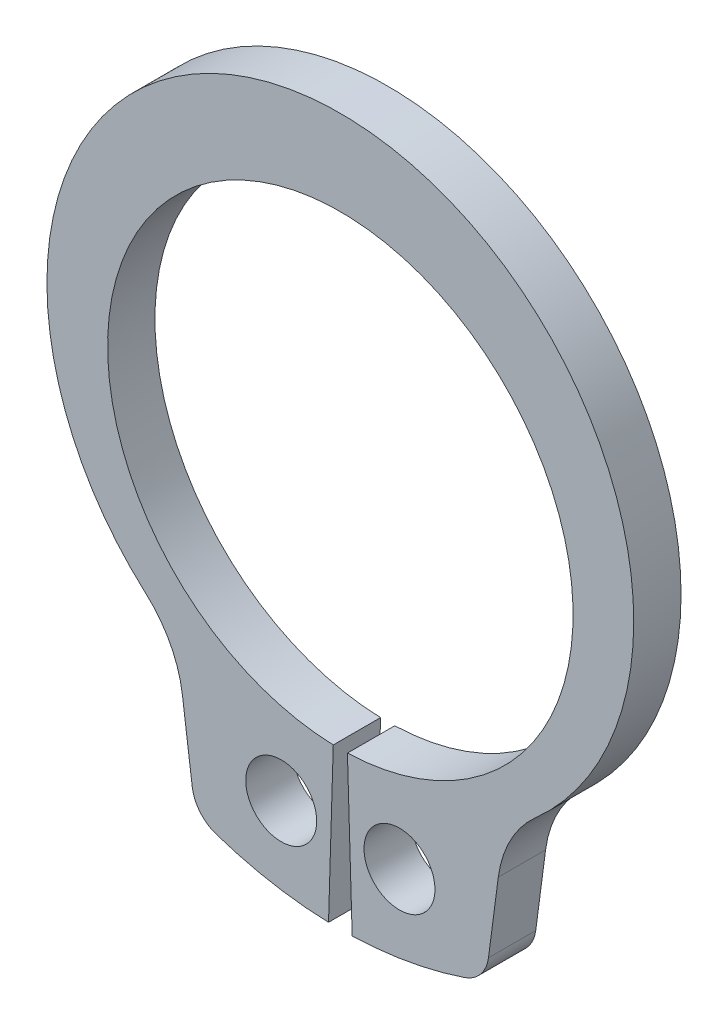
ISO-10303-21;
HEADER;
FILE_DESCRIPTION(('STEP AP214'),'2;1');
FILE_NAME('part.step','',(''),(''),'','','');
FILE_SCHEMA(('AUTOMOTIVE_DESIGN { 1 0 10303 214 1 1 1 1 }'));
ENDSEC;
DATA;
#1=APPLICATION_CONTEXT('core data for automotive mechanical design processes');
#2=APPLICATION_PROTOCOL_DEFINITION('international standard','automotive_design',2000,#1);
#3=PRODUCT_CONTEXT('',#1,'mechanical');
#4=PRODUCT('Part','Part','',(#3));
#5=PRODUCT_RELATED_PRODUCT_CATEGORY('part','',(#4));
#6=PRODUCT_DEFINITION_FORMATION('','',#4);
#7=PRODUCT_DEFINITION_CONTEXT('part definition',#1,'design');
#8=PRODUCT_DEFINITION('design','',#6,#7);
#9=PRODUCT_DEFINITION_SHAPE('','',#8);
#10=(LENGTH_UNIT() NAMED_UNIT(*) SI_UNIT(.MILLI.,.METRE.));
#11=(NAMED_UNIT(*) PLANE_ANGLE_UNIT() SI_UNIT($,.RADIAN.));
#12=(NAMED_UNIT(*) SI_UNIT($,.STERADIAN.) SOLID_ANGLE_UNIT());
#13=UNCERTAINTY_MEASURE_WITH_UNIT(LENGTH_MEASURE(1.E-05),#10,'distance_accuracy_value','');
#14=(GEOMETRIC_REPRESENTATION_CONTEXT(3) GLOBAL_UNCERTAINTY_ASSIGNED_CONTEXT((#13)) GLOBAL_UNIT_ASSIGNED_CONTEXT((#10,
#11,#12)) REPRESENTATION_CONTEXT('',''));
#15=CARTESIAN_POINT('',(0.,0.,0.));
#16=DIRECTION('',(0.,0.,1.));
#17=DIRECTION('',(1.,0.,0.));
#18=AXIS2_PLACEMENT_3D('',#15,#16,#17);
#19=CARTESIAN_POINT('',(0.,0.,-1.));
#20=DIRECTION('',(0.,0.,1.));
#21=DIRECTION('',(1.,0.,0.));
#22=AXIS2_PLACEMENT_3D('',#19,#20,#21);
#23=CYLINDRICAL_SURFACE('',#22,4.92);
#24=CARTESIAN_POINT('',(0.,0.,0.));
#25=DIRECTION('',(0.,0.,-1.));
#26=DIRECTION('',(1.,0.,0.));
#27=AXIS2_PLACEMENT_3D('',#24,#25,#26);
#28=CIRCLE('',#27,4.92);
#29=CARTESIAN_POINT('',(-0.14963503649635,-4.9177240015939,0.));
#30=VERTEX_POINT('',#29);
#31=CARTESIAN_POINT('',(0.14963503649635,-4.9177240015939,0.));
#32=VERTEX_POINT('',#31);
#33=EDGE_CURVE('E122',#30,#32,#28,.T.);
#34=ORIENTED_EDGE('',*,*,#33,.F.);
#35=DIRECTION('',(0.,0.,1.));
#36=VECTOR('',#35,1.);
#37=CARTESIAN_POINT('',(-0.14963503649635,-4.9177240015939,-1.));
#38=LINE('',#37,#36);
#39=CARTESIAN_POINT('',(-0.14963503649635,-4.9177240015939,-1.));
#40=VERTEX_POINT('',#39);
#41=EDGE_CURVE('E11',#40,#30,#38,.T.);
#42=ORIENTED_EDGE('',*,*,#41,.F.);
#43=CARTESIAN_POINT('',(0.,0.,-1.));
#44=DIRECTION('',(0.,0.,-1.));
#45=DIRECTION('',(1.,0.,0.));
#46=AXIS2_PLACEMENT_3D('',#43,#44,#45);
#47=CIRCLE('',#46,4.92);
#48=CARTESIAN_POINT('',(0.14963503649635,-4.9177240015939,-1.));
#49=VERTEX_POINT('',#48);
#50=EDGE_CURVE('E124',#40,#49,#47,.T.);
#51=ORIENTED_EDGE('',*,*,#50,.T.);
#52=DIRECTION('',(0.,0.,1.));
#53=VECTOR('',#52,1.);
#54=CARTESIAN_POINT('',(0.14963503649635,-4.9177240015939,-1.));
#55=LINE('',#54,#53);
#56=EDGE_CURVE('E37',#49,#32,#55,.T.);
#57=ORIENTED_EDGE('',*,*,#56,.T.);
#58=EDGE_LOOP('',(#34,#42,#51,#57));
#59=FACE_BOUND('',#58,.T.);
#60=ADVANCED_FACE('F34',(#59),#23,.F.);
#61=CARTESIAN_POINT('',(-0.14963503649635,-4.9177240015939,-1.));
#62=DIRECTION('',(0.999537398697947,-0.0304136253041363,0.));
#63=DIRECTION('',(0.0304136253041363,0.999537398697948,0.));
#64=AXIS2_PLACEMENT_3D('',#61,#62,#63);
#65=PLANE('',#64);
#66=DIRECTION('',(0.0304136253041363,0.999537398697948,0.));
#67=VECTOR('',#66,1.);
#68=CARTESIAN_POINT('',(-0.14963503649635,-4.9177240015939,0.));
#69=LINE('',#68,#67);
#70=CARTESIAN_POINT('',(-0.25,-8.21619741729713,0.));
#71=VERTEX_POINT('',#70);
#72=EDGE_CURVE('E140',#71,#30,#69,.T.);
#73=ORIENTED_EDGE('',*,*,#72,.F.);
#74=DIRECTION('',(0.,0.,1.));
#75=VECTOR('',#74,1.);
#76=CARTESIAN_POINT('',(-0.25,-8.21619741729713,-1.));
#77=LINE('',#76,#75);
#78=CARTESIAN_POINT('',(-0.25,-8.21619741729713,-1.));
#79=VERTEX_POINT('',#78);
#80=EDGE_CURVE('E42',#79,#71,#77,.T.);
#81=ORIENTED_EDGE('',*,*,#80,.F.);
#82=DIRECTION('',(0.0304136253041363,0.999537398697948,0.));
#83=VECTOR('',#82,1.);
#84=CARTESIAN_POINT('',(-0.14963503649635,-4.9177240015939,-1.));
#85=LINE('',#84,#83);
#86=EDGE_CURVE('E129',#79,#40,#85,.T.);
#87=ORIENTED_EDGE('',*,*,#86,.T.);
#88=ORIENTED_EDGE('',*,*,#41,.T.);
#89=EDGE_LOOP('',(#73,#81,#87,#88));
#90=FACE_BOUND('',#89,.T.);
#91=ADVANCED_FACE('F252',(#90),#65,.T.);
#92=CARTESIAN_POINT('',(0.,0.,-1.));
#93=DIRECTION('',(0.,0.,1.));
#94=DIRECTION('',(1.,0.,0.));
#95=AXIS2_PLACEMENT_3D('',#92,#93,#94);
#96=CYLINDRICAL_SURFACE('',#95,8.22);
#97=CARTESIAN_POINT('',(0.,0.,0.));
#98=DIRECTION('',(0.,0.,1.));
#99=DIRECTION('',(1.,0.,0.));
#100=AXIS2_PLACEMENT_3D('',#97,#98,#99);
#101=CIRCLE('',#100,8.22);
#102=CARTESIAN_POINT('',(-2.62681349790227,-7.78898265803939,0.));
#103=VERTEX_POINT('',#102);
#104=EDGE_CURVE('E170',#103,#71,#101,.T.);
#105=ORIENTED_EDGE('',*,*,#104,.F.);
#106=DIRECTION('',(0.,0.,1.));
#107=VECTOR('',#106,1.);
#108=CARTESIAN_POINT('',(-2.62681349790227,-7.78898265803939,-1.));
#109=LINE('',#108,#107);
#110=CARTESIAN_POINT('',(-2.62681349790227,-7.78898265803939,-1.));
#111=VERTEX_POINT('',#110);
#112=EDGE_CURVE('E204',#111,#103,#109,.T.);
#113=ORIENTED_EDGE('',*,*,#112,.F.);
#114=CARTESIAN_POINT('',(0.,0.,-1.));
#115=DIRECTION('',(0.,0.,1.));
#116=DIRECTION('',(1.,0.,0.));
#117=AXIS2_PLACEMENT_3D('',#114,#115,#116);
#118=CIRCLE('',#117,8.22);
#119=EDGE_CURVE('E200',#111,#79,#118,.T.);
#120=ORIENTED_EDGE('',*,*,#119,.T.);
#121=ORIENTED_EDGE('',*,*,#80,.T.);
#122=EDGE_LOOP('',(#105,#113,#120,#121));
#123=FACE_BOUND('',#122,.T.);
#124=ADVANCED_FACE('F257',(#123),#96,.T.);
#125=CARTESIAN_POINT('',(-2.38714073349513,-7.07830905785332,-1.));
#126=DIRECTION('',(0.,0.,1.));
#127=DIRECTION('',(1.,0.,0.));
#128=AXIS2_PLACEMENT_3D('',#125,#126,#127);
#129=CYLINDRICAL_SURFACE('',#128,0.750000000000002);
#130=CARTESIAN_POINT('',(-2.38714073349513,-7.07830905785332,0.));
#131=DIRECTION('',(0.,0.,1.));
#132=DIRECTION('',(1.,0.,0.));
#133=AXIS2_PLACEMENT_3D('',#130,#131,#132);
#134=CIRCLE('',#133,0.750000000000002);
#135=CARTESIAN_POINT('',(-3.13072437952549,-7.17620370201836,0.));
#136=VERTEX_POINT('',#135);
#137=EDGE_CURVE('E167',#136,#103,#134,.T.);
#138=ORIENTED_EDGE('',*,*,#137,.F.);
#139=DIRECTION('',(0.,0.,1.));
#140=VECTOR('',#139,1.);
#141=CARTESIAN_POINT('',(-3.13072437952549,-7.17620370201836,-1.));
#142=LINE('',#141,#140);
#143=CARTESIAN_POINT('',(-3.13072437952549,-7.17620370201836,-1.));
#144=VERTEX_POINT('',#143);
#145=EDGE_CURVE('E206',#144,#136,#142,.T.);
#146=ORIENTED_EDGE('',*,*,#145,.F.);
#147=CARTESIAN_POINT('',(-2.38714073349513,-7.07830905785332,-1.));
#148=DIRECTION('',(0.,0.,1.));
#149=DIRECTION('',(1.,0.,0.));
#150=AXIS2_PLACEMENT_3D('',#147,#148,#149);
#151=CIRCLE('',#150,0.750000000000002);
#152=EDGE_CURVE('E197',#144,#111,#151,.T.);
#153=ORIENTED_EDGE('',*,*,#152,.T.);
#154=ORIENTED_EDGE('',*,*,#112,.T.);
#155=EDGE_LOOP('',(#138,#146,#153,#154));
#156=FACE_BOUND('',#155,.T.);
#157=ADVANCED_FACE('F249',(#156),#129,.T.);
#158=CARTESIAN_POINT('',(-3.33891012449069,-5.59487597348818,-1.));
#159=DIRECTION('',(-0.991444861373811,-0.130526192220051,0.));
#160=DIRECTION('',(0.130526192220051,-0.991444861373811,0.));
#161=AXIS2_PLACEMENT_3D('',#158,#159,#160);
#162=PLANE('',#161);
#163=DIRECTION('',(0.130526192220051,-0.99144486137381,0.));
#164=VECTOR('',#163,1.);
#165=CARTESIAN_POINT('',(-3.33891012449069,-5.59487597348818,0.));
#166=LINE('',#165,#164);
#167=CARTESIAN_POINT('',(-3.33891012449069,-5.59487597348818,0.));
#168=VERTEX_POINT('',#167);
#169=EDGE_CURVE('E164',#168,#136,#166,.T.);
#170=ORIENTED_EDGE('',*,*,#169,.F.);
#171=DIRECTION('',(0.,0.,1.));
#172=VECTOR('',#171,1.);
#173=CARTESIAN_POINT('',(-3.33891012449069,-5.59487597348818,-1.));
#174=LINE('',#173,#172);
#175=CARTESIAN_POINT('',(-3.33891012449069,-5.59487597348818,-1.));
#176=VERTEX_POINT('',#175);
#177=EDGE_CURVE('E208',#176,#168,#174,.T.);
#178=ORIENTED_EDGE('',*,*,#177,.F.);
#179=DIRECTION('',(0.130526192220051,-0.99144486137381,0.));
#180=VECTOR('',#179,1.);
#181=CARTESIAN_POINT('',(-3.33891012449069,-5.59487597348818,-1.));
#182=LINE('',#181,#180);
#183=EDGE_CURVE('E194',#176,#144,#182,.T.);
#184=ORIENTED_EDGE('',*,*,#183,.T.);
#185=ORIENTED_EDGE('',*,*,#145,.T.);
#186=EDGE_LOOP('',(#170,#178,#184,#185));
#187=FACE_BOUND('',#186,.T.);
#188=ADVANCED_FACE('F245',(#187),#162,.T.);
#189=CARTESIAN_POINT('',(-5.71548705813683,-5.90775826251129,-1.));
#190=DIRECTION('',(0.,0.,1.));
#191=DIRECTION('',(1.,0.,0.));
#192=AXIS2_PLACEMENT_3D('',#189,#190,#191);
#193=CYLINDRICAL_SURFACE('',#192,2.39708432232227);
#194=CARTESIAN_POINT('',(-5.71548705813683,-5.90775826251129,0.));
#195=DIRECTION('',(0.,0.,-1.));
#196=DIRECTION('',(1.,0.,0.));
#197=AXIS2_PLACEMENT_3D('',#194,#195,#196);
#198=CIRCLE('',#197,2.39708432232227);
#199=CARTESIAN_POINT('',(-4.12231510789726,-4.11672046690421,0.));
#200=VERTEX_POINT('',#199);
#201=EDGE_CURVE('E161',#200,#168,#198,.T.);
#202=ORIENTED_EDGE('',*,*,#201,.F.);
#203=DIRECTION('',(0.,0.,1.));
#204=VECTOR('',#203,1.);
#205=CARTESIAN_POINT('',(-4.12231510789726,-4.11672046690421,-1.));
#206=LINE('',#205,#204);
#207=CARTESIAN_POINT('',(-4.12231510789726,-4.11672046690421,-1.));
#208=VERTEX_POINT('',#207);
#209=EDGE_CURVE('E210',#208,#200,#206,.T.);
#210=ORIENTED_EDGE('',*,*,#209,.F.);
#211=CARTESIAN_POINT('',(-5.71548705813683,-5.90775826251129,-1.));
#212=DIRECTION('',(0.,0.,-1.));
#213=DIRECTION('',(1.,0.,0.));
#214=AXIS2_PLACEMENT_3D('',#211,#212,#213);
#215=CIRCLE('',#214,2.39708432232227);
#216=EDGE_CURVE('E191',#208,#176,#215,.T.);
#217=ORIENTED_EDGE('',*,*,#216,.T.);
#218=ORIENTED_EDGE('',*,*,#177,.T.);
#219=EDGE_LOOP('',(#202,#210,#217,#218));
#220=FACE_BOUND('',#219,.T.);
#221=ADVANCED_FACE('F241',(#220),#193,.F.);
#222=CARTESIAN_POINT('',(0.,0.517570365630119,-1.));
#223=DIRECTION('',(0.,0.,1.));
#224=DIRECTION('',(1.,0.,0.));
#225=AXIS2_PLACEMENT_3D('',#222,#223,#224);
#226=CYLINDRICAL_SURFACE('',#225,6.20242963436988);
#227=CARTESIAN_POINT('',(0.,0.517570365630119,0.));
#228=DIRECTION('',(0.,0.,1.));
#229=DIRECTION('',(1.,0.,0.));
#230=AXIS2_PLACEMENT_3D('',#227,#228,#229);
#231=CIRCLE('',#230,6.20242963436988);
#232=CARTESIAN_POINT('',(4.12231510789726,-4.11672046690421,0.));
#233=VERTEX_POINT('',#232);
#234=EDGE_CURVE('E158',#233,#200,#231,.T.);
#235=ORIENTED_EDGE('',*,*,#234,.F.);
#236=DIRECTION('',(0.,0.,1.));
#237=VECTOR('',#236,1.);
#238=CARTESIAN_POINT('',(4.12231510789726,-4.11672046690421,-1.));
#239=LINE('',#238,#237);
#240=CARTESIAN_POINT('',(4.12231510789726,-4.11672046690421,-1.));
#241=VERTEX_POINT('',#240);
#242=EDGE_CURVE('E212',#241,#233,#239,.T.);
#243=ORIENTED_EDGE('',*,*,#242,.F.);
#244=CARTESIAN_POINT('',(0.,0.517570365630119,-1.));
#245=DIRECTION('',(0.,0.,1.));
#246=DIRECTION('',(1.,0.,0.));
#247=AXIS2_PLACEMENT_3D('',#244,#245,#246);
#248=CIRCLE('',#247,6.20242963436988);
#249=EDGE_CURVE('E188',#241,#208,#248,.T.);
#250=ORIENTED_EDGE('',*,*,#249,.T.);
#251=ORIENTED_EDGE('',*,*,#209,.T.);
#252=EDGE_LOOP('',(#235,#243,#250,#251));
#253=FACE_BOUND('',#252,.T.);
#254=ADVANCED_FACE('F237',(#253),#226,.T.);
#255=CARTESIAN_POINT('',(5.71548705813683,-5.90775826251129,-1.));
#256=DIRECTION('',(0.,0.,1.));
#257=DIRECTION('',(1.,0.,0.));
#258=AXIS2_PLACEMENT_3D('',#255,#256,#257);
#259=CYLINDRICAL_SURFACE('',#258,2.39708432232227);
#260=CARTESIAN_POINT('',(5.71548705813683,-5.90775826251129,0.));
#261=DIRECTION('',(0.,0.,-1.));
#262=DIRECTION('',(1.,0.,0.));
#263=AXIS2_PLACEMENT_3D('',#260,#261,#262);
#264=CIRCLE('',#263,2.39708432232227);
#265=CARTESIAN_POINT('',(3.33891012449069,-5.59487597348818,0.));
#266=VERTEX_POINT('',#265);
#267=EDGE_CURVE('E155',#266,#233,#264,.T.);
#268=ORIENTED_EDGE('',*,*,#267,.F.);
#269=DIRECTION('',(0.,0.,1.));
#270=VECTOR('',#269,1.);
#271=CARTESIAN_POINT('',(3.33891012449069,-5.59487597348818,-1.));
#272=LINE('',#271,#270);
#273=CARTESIAN_POINT('',(3.33891012449069,-5.59487597348818,-1.));
#274=VERTEX_POINT('',#273);
#275=EDGE_CURVE('E214',#274,#266,#272,.T.);
#276=ORIENTED_EDGE('',*,*,#275,.F.);
#277=CARTESIAN_POINT('',(5.71548705813683,-5.90775826251129,-1.));
#278=DIRECTION('',(0.,0.,-1.));
#279=DIRECTION('',(1.,0.,0.));
#280=AXIS2_PLACEMENT_3D('',#277,#278,#279);
#281=CIRCLE('',#280,2.39708432232227);
#282=EDGE_CURVE('E185',#274,#241,#281,.T.);
#283=ORIENTED_EDGE('',*,*,#282,.T.);
#284=ORIENTED_EDGE('',*,*,#242,.T.);
#285=EDGE_LOOP('',(#268,#276,#283,#284));
#286=FACE_BOUND('',#285,.T.);
#287=ADVANCED_FACE('F233',(#286),#259,.F.);
#288=CARTESIAN_POINT('',(3.33891012449069,-5.59487597348818,-1.));
#289=DIRECTION('',(0.991444861373811,-0.130526192220051,0.));
#290=DIRECTION('',(0.130526192220051,0.991444861373811,0.));
#291=AXIS2_PLACEMENT_3D('',#288,#289,#290);
#292=PLANE('',#291);
#293=DIRECTION('',(0.130526192220051,0.99144486137381,0.));
#294=VECTOR('',#293,1.);
#295=CARTESIAN_POINT('',(3.33891012449069,-5.59487597348818,0.));
#296=LINE('',#295,#294);
#297=CARTESIAN_POINT('',(3.13072437952549,-7.17620370201836,0.));
#298=VERTEX_POINT('',#297);
#299=EDGE_CURVE('E152',#298,#266,#296,.T.);
#300=ORIENTED_EDGE('',*,*,#299,.F.);
#301=DIRECTION('',(0.,0.,1.));
#302=VECTOR('',#301,1.);
#303=CARTESIAN_POINT('',(3.13072437952549,-7.17620370201836,-1.));
#304=LINE('',#303,#302);
#305=CARTESIAN_POINT('',(3.13072437952549,-7.17620370201836,-1.));
#306=VERTEX_POINT('',#305);
#307=EDGE_CURVE('E216',#306,#298,#304,.T.);
#308=ORIENTED_EDGE('',*,*,#307,.F.);
#309=DIRECTION('',(0.130526192220051,0.99144486137381,0.));
#310=VECTOR('',#309,1.);
#311=CARTESIAN_POINT('',(3.33891012449069,-5.59487597348818,-1.));
#312=LINE('',#311,#310);
#313=EDGE_CURVE('E182',#306,#274,#312,.T.);
#314=ORIENTED_EDGE('',*,*,#313,.T.);
#315=ORIENTED_EDGE('',*,*,#275,.T.);
#316=EDGE_LOOP('',(#300,#308,#314,#315));
#317=FACE_BOUND('',#316,.T.);
#318=ADVANCED_FACE('F229',(#317),#292,.T.);
#319=CARTESIAN_POINT('',(2.38714073349513,-7.07830905785332,-1.));
#320=DIRECTION('',(0.,0.,1.));
#321=DIRECTION('',(1.,0.,0.));
#322=AXIS2_PLACEMENT_3D('',#319,#320,#321);
#323=CYLINDRICAL_SURFACE('',#322,0.750000000000002);
#324=CARTESIAN_POINT('',(2.38714073349513,-7.07830905785332,0.));
#325=DIRECTION('',(0.,0.,1.));
#326=DIRECTION('',(-1.,0.,0.));
#327=AXIS2_PLACEMENT_3D('',#324,#325,#326);
#328=CIRCLE('',#327,0.750000000000002);
#329=CARTESIAN_POINT('',(2.62681349790227,-7.78898265803939,0.));
#330=VERTEX_POINT('',#329);
#331=EDGE_CURVE('E149',#330,#298,#328,.T.);
#332=ORIENTED_EDGE('',*,*,#331,.F.);
#333=DIRECTION('',(0.,0.,1.));
#334=VECTOR('',#333,1.);
#335=CARTESIAN_POINT('',(2.62681349790227,-7.78898265803939,-1.));
#336=LINE('',#335,#334);
#337=CARTESIAN_POINT('',(2.62681349790227,-7.78898265803939,-1.));
#338=VERTEX_POINT('',#337);
#339=EDGE_CURVE('E218',#338,#330,#336,.T.);
#340=ORIENTED_EDGE('',*,*,#339,.F.);
#341=CARTESIAN_POINT('',(2.38714073349513,-7.07830905785332,-1.));
#342=DIRECTION('',(0.,0.,1.));
#343=DIRECTION('',(-1.,0.,0.));
#344=AXIS2_PLACEMENT_3D('',#341,#342,#343);
#345=CIRCLE('',#344,0.750000000000002);
#346=EDGE_CURVE('E179',#338,#306,#345,.T.);
#347=ORIENTED_EDGE('',*,*,#346,.T.);
#348=ORIENTED_EDGE('',*,*,#307,.T.);
#349=EDGE_LOOP('',(#332,#340,#347,#348));
#350=FACE_BOUND('',#349,.T.);
#351=ADVANCED_FACE('F225',(#350),#323,.T.);
#352=CARTESIAN_POINT('',(0.,0.,-1.));
#353=DIRECTION('',(0.,0.,1.));
#354=DIRECTION('',(1.,0.,0.));
#355=AXIS2_PLACEMENT_3D('',#352,#353,#354);
#356=CYLINDRICAL_SURFACE('',#355,8.22);
#357=CARTESIAN_POINT('',(0.,0.,0.));
#358=DIRECTION('',(0.,0.,1.));
#359=DIRECTION('',(1.,0.,0.));
#360=AXIS2_PLACEMENT_3D('',#357,#358,#359);
#361=CIRCLE('',#360,8.22);
#362=CARTESIAN_POINT('',(0.249999999999999,-8.21619741729713,0.));
#363=VERTEX_POINT('',#362);
#364=EDGE_CURVE('E136',#363,#330,#361,.T.);
#365=ORIENTED_EDGE('',*,*,#364,.F.);
#366=DIRECTION('',(0.,0.,1.));
#367=VECTOR('',#366,1.);
#368=CARTESIAN_POINT('',(0.249999999999999,-8.21619741729713,-1.));
#369=LINE('',#368,#367);
#370=CARTESIAN_POINT('',(0.249999999999999,-8.21619741729713,-1.));
#371=VERTEX_POINT('',#370);
#372=EDGE_CURVE('E128',#371,#363,#369,.T.);
#373=ORIENTED_EDGE('',*,*,#372,.F.);
#374=CARTESIAN_POINT('',(0.,0.,-1.));
#375=DIRECTION('',(0.,0.,1.));
#376=DIRECTION('',(1.,0.,0.));
#377=AXIS2_PLACEMENT_3D('',#374,#375,#376);
#378=CIRCLE('',#377,8.22);
#379=EDGE_CURVE('E176',#371,#338,#378,.T.);
#380=ORIENTED_EDGE('',*,*,#379,.T.);
#381=ORIENTED_EDGE('',*,*,#339,.T.);
#382=EDGE_LOOP('',(#365,#373,#380,#381));
#383=FACE_BOUND('',#382,.T.);
#384=ADVANCED_FACE('F221',(#383),#356,.T.);
#385=CARTESIAN_POINT('',(0.14963503649635,-4.9177240015939,-1.));
#386=DIRECTION('',(-0.999537398697947,-0.0304136253041363,0.));
#387=DIRECTION('',(0.0304136253041363,-0.999537398697948,0.));
#388=AXIS2_PLACEMENT_3D('',#385,#386,#387);
#389=PLANE('',#388);
#390=DIRECTION('',(0.0304136253041363,-0.999537398697948,0.));
#391=VECTOR('',#390,1.);
#392=CARTESIAN_POINT('',(0.14963503649635,-4.9177240015939,0.));
#393=LINE('',#392,#391);
#394=EDGE_CURVE('E131',#32,#363,#393,.T.);
#395=ORIENTED_EDGE('',*,*,#394,.F.);
#396=ORIENTED_EDGE('',*,*,#56,.F.);
#397=DIRECTION('',(0.0304136253041363,-0.999537398697948,0.));
#398=VECTOR('',#397,1.);
#399=CARTESIAN_POINT('',(0.14963503649635,-4.9177240015939,-1.));
#400=LINE('',#399,#398);
#401=EDGE_CURVE('E174',#49,#371,#400,.T.);
#402=ORIENTED_EDGE('',*,*,#401,.T.);
#403=ORIENTED_EDGE('',*,*,#372,.T.);
#404=EDGE_LOOP('',(#395,#396,#402,#403));
#405=FACE_BOUND('',#404,.T.);
#406=ADVANCED_FACE('F132',(#405),#389,.T.);
#407=CARTESIAN_POINT('',(0.,0.,-1.));
#408=DIRECTION('',(0.,0.,1.));
#409=DIRECTION('',(1.,0.,0.));
#410=AXIS2_PLACEMENT_3D('',#407,#408,#409);
#411=PLANE('',#410);
#412=CARTESIAN_POINT('',(-1.25,-6.49073185395915,-1.));
#413=DIRECTION('',(0.,0.,1.));
#414=DIRECTION('',(1.,0.,0.));
#415=AXIS2_PLACEMENT_3D('',#412,#413,#414);
#416=CIRCLE('',#415,0.75);
#417=CARTESIAN_POINT('',(-0.5,-6.49073185395915,-1.));
#418=VERTEX_POINT('',#417);
#419=EDGE_CURVE('E391',#418,#418,#416,.T.);
#420=ORIENTED_EDGE('',*,*,#419,.T.);
#421=EDGE_LOOP('',(#420));
#422=FACE_BOUND('',#421,.T.);
#423=CARTESIAN_POINT('',(1.25,-6.49073185395915,-1.));
#424=DIRECTION('',(0.,0.,1.));
#425=DIRECTION('',(1.,0.,0.));
#426=AXIS2_PLACEMENT_3D('',#423,#424,#425);
#427=CIRCLE('',#426,0.75);
#428=CARTESIAN_POINT('',(2.,-6.49073185395915,-1.));
#429=VERTEX_POINT('',#428);
#430=EDGE_CURVE('E141',#429,#429,#427,.T.);
#431=ORIENTED_EDGE('',*,*,#430,.T.);
#432=EDGE_LOOP('',(#431));
#433=FACE_BOUND('',#432,.T.);
#434=ORIENTED_EDGE('',*,*,#50,.F.);
#435=ORIENTED_EDGE('',*,*,#86,.F.);
#436=ORIENTED_EDGE('',*,*,#119,.F.);
#437=ORIENTED_EDGE('',*,*,#152,.F.);
#438=ORIENTED_EDGE('',*,*,#183,.F.);
#439=ORIENTED_EDGE('',*,*,#216,.F.);
#440=ORIENTED_EDGE('',*,*,#249,.F.);
#441=ORIENTED_EDGE('',*,*,#282,.F.);
#442=ORIENTED_EDGE('',*,*,#313,.F.);
#443=ORIENTED_EDGE('',*,*,#346,.F.);
#444=ORIENTED_EDGE('',*,*,#379,.F.);
#445=ORIENTED_EDGE('',*,*,#401,.F.);
#446=EDGE_LOOP('',(#434,#435,#436,#437,#438,#439,#440,#441,#442,#443,#444,#445));
#447=FACE_BOUND('',#446,.T.);
#448=ADVANCED_FACE('F256',(#422,#433,#447),#411,.F.);
#449=CARTESIAN_POINT('',(0.,0.,0.));
#450=DIRECTION('',(0.,0.,1.));
#451=DIRECTION('',(1.,0.,0.));
#452=AXIS2_PLACEMENT_3D('',#449,#450,#451);
#453=PLANE('',#452);
#454=CARTESIAN_POINT('',(-1.25,-6.49073185395915,0.));
#455=DIRECTION('',(0.,0.,1.));
#456=DIRECTION('',(1.,0.,0.));
#457=AXIS2_PLACEMENT_3D('',#454,#455,#456);
#458=CIRCLE('',#457,0.75);
#459=CARTESIAN_POINT('',(-0.5,-6.49073185395915,0.));
#460=VERTEX_POINT('',#459);
#461=EDGE_CURVE('E394',#460,#460,#458,.T.);
#462=ORIENTED_EDGE('',*,*,#461,.F.);
#463=EDGE_LOOP('',(#462));
#464=FACE_BOUND('',#463,.T.);
#465=CARTESIAN_POINT('',(1.25,-6.49073185395915,0.));
#466=DIRECTION('',(0.,0.,1.));
#467=DIRECTION('',(1.,0.,0.));
#468=AXIS2_PLACEMENT_3D('',#465,#466,#467);
#469=CIRCLE('',#468,0.75);
#470=CARTESIAN_POINT('',(2.,-6.49073185395915,0.));
#471=VERTEX_POINT('',#470);
#472=EDGE_CURVE('E144',#471,#471,#469,.T.);
#473=ORIENTED_EDGE('',*,*,#472,.F.);
#474=EDGE_LOOP('',(#473));
#475=FACE_BOUND('',#474,.T.);
#476=ORIENTED_EDGE('',*,*,#33,.T.);
#477=ORIENTED_EDGE('',*,*,#394,.T.);
#478=ORIENTED_EDGE('',*,*,#364,.T.);
#479=ORIENTED_EDGE('',*,*,#331,.T.);
#480=ORIENTED_EDGE('',*,*,#299,.T.);
#481=ORIENTED_EDGE('',*,*,#267,.T.);
#482=ORIENTED_EDGE('',*,*,#234,.T.);
#483=ORIENTED_EDGE('',*,*,#201,.T.);
#484=ORIENTED_EDGE('',*,*,#169,.T.);
#485=ORIENTED_EDGE('',*,*,#137,.T.);
#486=ORIENTED_EDGE('',*,*,#104,.T.);
#487=ORIENTED_EDGE('',*,*,#72,.T.);
#488=EDGE_LOOP('',(#476,#477,#478,#479,#480,#481,#482,#483,#484,#485,#486,#487));
#489=FACE_BOUND('',#488,.T.);
#490=ADVANCED_FACE('F138',(#464,#475,#489),#453,.T.);
#491=CARTESIAN_POINT('',(1.25,-6.49073185395915,-1.));
#492=DIRECTION('',(0.,0.,1.));
#493=DIRECTION('',(1.,0.,0.));
#494=AXIS2_PLACEMENT_3D('',#491,#492,#493);
#495=CYLINDRICAL_SURFACE('',#494,0.75);
#496=ORIENTED_EDGE('',*,*,#430,.F.);
#497=EDGE_LOOP('',(#496));
#498=FACE_BOUND('',#497,.T.);
#499=ORIENTED_EDGE('',*,*,#472,.T.);
#500=EDGE_LOOP('',(#499));
#501=FACE_BOUND('',#500,.T.);
#502=ADVANCED_FACE('F364',(#498,#501),#495,.F.);
#503=CARTESIAN_POINT('',(-1.25,-6.49073185395915,-1.));
#504=DIRECTION('',(0.,0.,1.));
#505=DIRECTION('',(1.,0.,0.));
#506=AXIS2_PLACEMENT_3D('',#503,#504,#505);
#507=CYLINDRICAL_SURFACE('',#506,0.75);
#508=ORIENTED_EDGE('',*,*,#419,.F.);
#509=EDGE_LOOP('',(#508));
#510=FACE_BOUND('',#509,.T.);
#511=ORIENTED_EDGE('',*,*,#461,.T.);
#512=EDGE_LOOP('',(#511));
#513=FACE_BOUND('',#512,.T.);
#514=ADVANCED_FACE('F374',(#510,#513),#507,.F.);
#515=CLOSED_SHELL('',(#60,#91,#124,#157,#188,#221,#254,#287,#318,#351,#384,#406,#448,#490,#502,#514));
#516=MANIFOLD_SOLID_BREP('B2',#515);
#517=ADVANCED_BREP_SHAPE_REPRESENTATION('',(#18,#516),#14);
#518=SHAPE_DEFINITION_REPRESENTATION(#9,#517);
ENDSEC;
END-ISO-10303-21;
